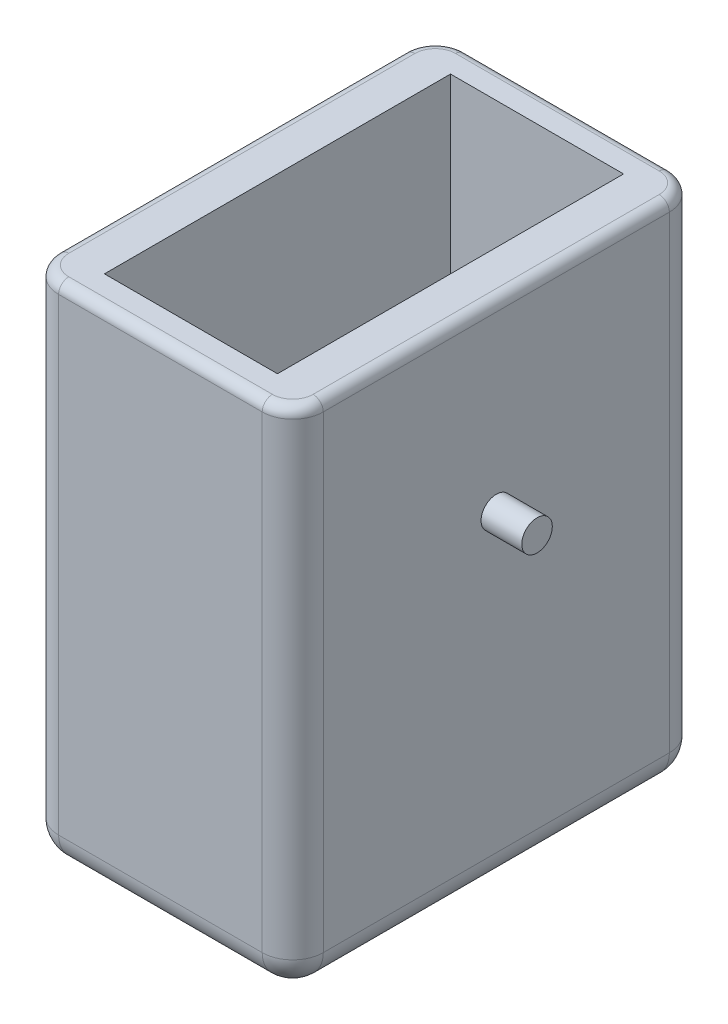
ISO-10303-21;
HEADER;
FILE_DESCRIPTION(('STEP AP214'),'2;1');
FILE_NAME('part.step','',(''),(''),'','','');
FILE_SCHEMA(('AUTOMOTIVE_DESIGN { 1 0 10303 214 1 1 1 1 }'));
ENDSEC;
DATA;
#1=APPLICATION_CONTEXT('core data for automotive mechanical design processes');
#2=APPLICATION_PROTOCOL_DEFINITION('international standard','automotive_design',2000,#1);
#3=PRODUCT_CONTEXT('',#1,'mechanical');
#4=PRODUCT('Part','Part','',(#3));
#5=PRODUCT_RELATED_PRODUCT_CATEGORY('part','',(#4));
#6=PRODUCT_DEFINITION_FORMATION('','',#4);
#7=PRODUCT_DEFINITION_CONTEXT('part definition',#1,'design');
#8=PRODUCT_DEFINITION('design','',#6,#7);
#9=PRODUCT_DEFINITION_SHAPE('','',#8);
#10=(LENGTH_UNIT() NAMED_UNIT(*) SI_UNIT(.MILLI.,.METRE.));
#11=(NAMED_UNIT(*) PLANE_ANGLE_UNIT() SI_UNIT($,.RADIAN.));
#12=(NAMED_UNIT(*) SI_UNIT($,.STERADIAN.) SOLID_ANGLE_UNIT());
#13=UNCERTAINTY_MEASURE_WITH_UNIT(LENGTH_MEASURE(1.E-05),#10,'distance_accuracy_value','');
#14=(GEOMETRIC_REPRESENTATION_CONTEXT(3) GLOBAL_UNCERTAINTY_ASSIGNED_CONTEXT((#13)) GLOBAL_UNIT_ASSIGNED_CONTEXT((#10,
#11,#12)) REPRESENTATION_CONTEXT('',''));
#15=CARTESIAN_POINT('',(0.,0.,0.));
#16=DIRECTION('',(0.,0.,1.));
#17=DIRECTION('',(1.,0.,0.));
#18=AXIS2_PLACEMENT_3D('',#15,#16,#17);
#19=CARTESIAN_POINT('',(0.,50.,0.));
#20=DIRECTION('',(-1.,0.,0.));
#21=DIRECTION('',(0.,0.,1.));
#22=AXIS2_PLACEMENT_3D('',#19,#20,#21);
#23=PLANE('',#22);
#24=CARTESIAN_POINT('',(0.,32.,-20.));
#25=DIRECTION('',(-1.,0.,0.));
#26=DIRECTION('',(0.,0.,1.));
#27=AXIS2_PLACEMENT_3D('',#24,#25,#26);
#28=CIRCLE('',#27,1.5);
#29=CARTESIAN_POINT('',(0.,32.,-18.5));
#30=VERTEX_POINT('',#29);
#31=EDGE_CURVE('E11',#30,#30,#28,.F.);
#32=ORIENTED_EDGE('',*,*,#31,.F.);
#33=EDGE_LOOP('',(#32));
#34=FACE_BOUND('',#33,.T.);
#35=DIRECTION('',(0.,-1.,0.));
#36=VECTOR('',#35,1.);
#37=CARTESIAN_POINT('',(0.,50.,-37.));
#38=LINE('',#37,#36);
#39=CARTESIAN_POINT('',(0.,3.,-37.));
#40=VERTEX_POINT('',#39);
#41=CARTESIAN_POINT('',(0.,49.,-37.));
#42=VERTEX_POINT('',#41);
#43=EDGE_CURVE('E243',#40,#42,#38,.F.);
#44=ORIENTED_EDGE('',*,*,#43,.T.);
#45=DIRECTION('',(0.,0.,-1.));
#46=VECTOR('',#45,1.);
#47=CARTESIAN_POINT('',(0.,49.,-3.));
#48=LINE('',#47,#46);
#49=CARTESIAN_POINT('',(0.,49.,-3.));
#50=VERTEX_POINT('',#49);
#51=EDGE_CURVE('E304',#42,#50,#48,.F.);
#52=ORIENTED_EDGE('',*,*,#51,.T.);
#53=DIRECTION('',(0.,-1.,0.));
#54=VECTOR('',#53,1.);
#55=CARTESIAN_POINT('',(0.,50.,-3.));
#56=LINE('',#55,#54);
#57=CARTESIAN_POINT('',(0.,3.,-3.));
#58=VERTEX_POINT('',#57);
#59=EDGE_CURVE('E239',#50,#58,#56,.T.);
#60=ORIENTED_EDGE('',*,*,#59,.T.);
#61=DIRECTION('',(0.,0.,-1.));
#62=VECTOR('',#61,1.);
#63=CARTESIAN_POINT('',(0.,3.,0.));
#64=LINE('',#63,#62);
#65=EDGE_CURVE('E241',#58,#40,#64,.T.);
#66=ORIENTED_EDGE('',*,*,#65,.T.);
#67=EDGE_LOOP('',(#44,#52,#60,#66));
#68=FACE_BOUND('',#67,.T.);
#69=ADVANCED_FACE('F37',(#34,#68),#23,.F.);
#70=CARTESIAN_POINT('',(0.,50.,-40.));
#71=DIRECTION('',(0.,0.,1.));
#72=DIRECTION('',(1.,0.,0.));
#73=AXIS2_PLACEMENT_3D('',#70,#71,#72);
#74=PLANE('',#73);
#75=DIRECTION('',(0.,-1.,0.));
#76=VECTOR('',#75,1.);
#77=CARTESIAN_POINT('',(-23.,50.,-40.));
#78=LINE('',#77,#76);
#79=CARTESIAN_POINT('',(-23.,3.,-40.));
#80=VERTEX_POINT('',#79);
#81=CARTESIAN_POINT('',(-23.,49.,-40.));
#82=VERTEX_POINT('',#81);
#83=EDGE_CURVE('E215',#80,#82,#78,.F.);
#84=ORIENTED_EDGE('',*,*,#83,.T.);
#85=DIRECTION('',(-1.,0.,0.));
#86=VECTOR('',#85,1.);
#87=CARTESIAN_POINT('',(-3.00000000000001,49.,-40.));
#88=LINE('',#87,#86);
#89=CARTESIAN_POINT('',(-3.00000000000001,49.,-40.));
#90=VERTEX_POINT('',#89);
#91=EDGE_CURVE('E300',#82,#90,#88,.F.);
#92=ORIENTED_EDGE('',*,*,#91,.T.);
#93=DIRECTION('',(0.,-1.,0.));
#94=VECTOR('',#93,1.);
#95=CARTESIAN_POINT('',(-3.00000000000001,50.,-40.));
#96=LINE('',#95,#94);
#97=CARTESIAN_POINT('',(-3.00000000000001,3.,-40.));
#98=VERTEX_POINT('',#97);
#99=EDGE_CURVE('E207',#90,#98,#96,.T.);
#100=ORIENTED_EDGE('',*,*,#99,.T.);
#101=DIRECTION('',(-1.,0.,0.));
#102=VECTOR('',#101,1.);
#103=CARTESIAN_POINT('',(0.,3.,-40.));
#104=LINE('',#103,#102);
#105=EDGE_CURVE('E212',#98,#80,#104,.T.);
#106=ORIENTED_EDGE('',*,*,#105,.T.);
#107=EDGE_LOOP('',(#84,#92,#100,#106));
#108=FACE_BOUND('',#107,.T.);
#109=ADVANCED_FACE('F341',(#108),#74,.F.);
#110=CARTESIAN_POINT('',(-26.,50.,0.));
#111=DIRECTION('',(1.,0.,0.));
#112=DIRECTION('',(0.,0.,-1.));
#113=AXIS2_PLACEMENT_3D('',#110,#111,#112);
#114=PLANE('',#113);
#115=CARTESIAN_POINT('',(-26.,32.,-20.));
#116=DIRECTION('',(1.,0.,0.));
#117=DIRECTION('',(0.,0.,-1.));
#118=AXIS2_PLACEMENT_3D('',#115,#116,#117);
#119=CIRCLE('',#118,1.5);
#120=CARTESIAN_POINT('',(-26.,32.,-21.5));
#121=VERTEX_POINT('',#120);
#122=EDGE_CURVE('E45',#121,#121,#119,.F.);
#123=ORIENTED_EDGE('',*,*,#122,.F.);
#124=EDGE_LOOP('',(#123));
#125=FACE_BOUND('',#124,.T.);
#126=DIRECTION('',(0.,-1.,0.));
#127=VECTOR('',#126,1.);
#128=CARTESIAN_POINT('',(-26.,50.,-3.));
#129=LINE('',#128,#127);
#130=CARTESIAN_POINT('',(-26.,3.,-3.));
#131=VERTEX_POINT('',#130);
#132=CARTESIAN_POINT('',(-26.,49.,-3.));
#133=VERTEX_POINT('',#132);
#134=EDGE_CURVE('E227',#131,#133,#129,.F.);
#135=ORIENTED_EDGE('',*,*,#134,.T.);
#136=DIRECTION('',(0.,0.,1.));
#137=VECTOR('',#136,1.);
#138=CARTESIAN_POINT('',(-26.,49.,-37.));
#139=LINE('',#138,#137);
#140=CARTESIAN_POINT('',(-26.,49.,-37.));
#141=VERTEX_POINT('',#140);
#142=EDGE_CURVE('E310',#133,#141,#139,.F.);
#143=ORIENTED_EDGE('',*,*,#142,.T.);
#144=DIRECTION('',(0.,-1.,0.));
#145=VECTOR('',#144,1.);
#146=CARTESIAN_POINT('',(-26.,50.,-37.));
#147=LINE('',#146,#145);
#148=CARTESIAN_POINT('',(-26.,3.,-37.));
#149=VERTEX_POINT('',#148);
#150=EDGE_CURVE('E231',#141,#149,#147,.T.);
#151=ORIENTED_EDGE('',*,*,#150,.T.);
#152=DIRECTION('',(0.,0.,1.));
#153=VECTOR('',#152,1.);
#154=CARTESIAN_POINT('',(-26.,3.,0.));
#155=LINE('',#154,#153);
#156=EDGE_CURVE('E229',#149,#131,#155,.T.);
#157=ORIENTED_EDGE('',*,*,#156,.T.);
#158=EDGE_LOOP('',(#135,#143,#151,#157));
#159=FACE_BOUND('',#158,.T.);
#160=ADVANCED_FACE('F337',(#125,#159),#114,.F.);
#161=CARTESIAN_POINT('',(0.,50.,0.));
#162=DIRECTION('',(0.,0.,-1.));
#163=DIRECTION('',(-1.,0.,0.));
#164=AXIS2_PLACEMENT_3D('',#161,#162,#163);
#165=PLANE('',#164);
#166=DIRECTION('',(0.,-1.,0.));
#167=VECTOR('',#166,1.);
#168=CARTESIAN_POINT('',(-3.,50.,0.));
#169=LINE('',#168,#167);
#170=CARTESIAN_POINT('',(-3.,3.,0.));
#171=VERTEX_POINT('',#170);
#172=CARTESIAN_POINT('',(-3.,49.,0.));
#173=VERTEX_POINT('',#172);
#174=EDGE_CURVE('E237',#171,#173,#169,.F.);
#175=ORIENTED_EDGE('',*,*,#174,.T.);
#176=DIRECTION('',(1.,0.,0.));
#177=VECTOR('',#176,1.);
#178=CARTESIAN_POINT('',(-23.,49.,0.));
#179=LINE('',#178,#177);
#180=CARTESIAN_POINT('',(-23.,49.,0.));
#181=VERTEX_POINT('',#180);
#182=EDGE_CURVE('E60',#173,#181,#179,.F.);
#183=ORIENTED_EDGE('',*,*,#182,.T.);
#184=DIRECTION('',(0.,-1.,0.));
#185=VECTOR('',#184,1.);
#186=CARTESIAN_POINT('',(-23.,50.,0.));
#187=LINE('',#186,#185);
#188=CARTESIAN_POINT('',(-23.,3.,0.));
#189=VERTEX_POINT('',#188);
#190=EDGE_CURVE('E233',#181,#189,#187,.T.);
#191=ORIENTED_EDGE('',*,*,#190,.T.);
#192=DIRECTION('',(1.,0.,0.));
#193=VECTOR('',#192,1.);
#194=CARTESIAN_POINT('',(0.,3.,0.));
#195=LINE('',#194,#193);
#196=EDGE_CURVE('E235',#189,#171,#195,.T.);
#197=ORIENTED_EDGE('',*,*,#196,.T.);
#198=EDGE_LOOP('',(#175,#183,#191,#197));
#199=FACE_BOUND('',#198,.T.);
#200=ADVANCED_FACE('F340',(#199),#165,.F.);
#201=CARTESIAN_POINT('',(0.,50.,0.));
#202=DIRECTION('',(0.,1.,0.));
#203=DIRECTION('',(0.,0.,1.));
#204=AXIS2_PLACEMENT_3D('',#201,#202,#203);
#205=PLANE('',#204);
#206=DIRECTION('',(-1.,0.,0.));
#207=VECTOR('',#206,1.);
#208=CARTESIAN_POINT('',(-23.,50.,-39.));
#209=LINE('',#208,#207);
#210=CARTESIAN_POINT('',(-3.00000000000001,50.,-39.));
#211=VERTEX_POINT('',#210);
#212=CARTESIAN_POINT('',(-23.,50.,-39.));
#213=VERTEX_POINT('',#212);
#214=EDGE_CURVE('E292',#211,#213,#209,.T.);
#215=ORIENTED_EDGE('',*,*,#214,.T.);
#216=CARTESIAN_POINT('',(-23.,50.,-37.));
#217=DIRECTION('',(0.,1.,0.));
#218=DIRECTION('',(0.,0.,1.));
#219=AXIS2_PLACEMENT_3D('',#216,#217,#218);
#220=CIRCLE('',#219,2.);
#221=CARTESIAN_POINT('',(-25.,50.,-37.));
#222=VERTEX_POINT('',#221);
#223=EDGE_CURVE('E294',#213,#222,#220,.T.);
#224=ORIENTED_EDGE('',*,*,#223,.T.);
#225=DIRECTION('',(0.,0.,1.));
#226=VECTOR('',#225,1.);
#227=CARTESIAN_POINT('',(-25.,50.,-3.));
#228=LINE('',#227,#226);
#229=CARTESIAN_POINT('',(-25.,50.,-3.));
#230=VERTEX_POINT('',#229);
#231=EDGE_CURVE('E246',#222,#230,#228,.T.);
#232=ORIENTED_EDGE('',*,*,#231,.T.);
#233=CARTESIAN_POINT('',(-23.,50.,-3.));
#234=DIRECTION('',(0.,1.,0.));
#235=DIRECTION('',(0.,0.,1.));
#236=AXIS2_PLACEMENT_3D('',#233,#234,#235);
#237=CIRCLE('',#236,2.);
#238=CARTESIAN_POINT('',(-23.,50.,-0.999999999999997));
#239=VERTEX_POINT('',#238);
#240=EDGE_CURVE('E282',#230,#239,#237,.T.);
#241=ORIENTED_EDGE('',*,*,#240,.T.);
#242=DIRECTION('',(1.,0.,0.));
#243=VECTOR('',#242,1.);
#244=CARTESIAN_POINT('',(-3.,50.,-1.));
#245=LINE('',#244,#243);
#246=CARTESIAN_POINT('',(-3.,50.,-1.));
#247=VERTEX_POINT('',#246);
#248=EDGE_CURVE('E284',#239,#247,#245,.T.);
#249=ORIENTED_EDGE('',*,*,#248,.T.);
#250=CARTESIAN_POINT('',(-3.,50.,-3.));
#251=DIRECTION('',(0.,1.,0.));
#252=DIRECTION('',(0.,0.,1.));
#253=AXIS2_PLACEMENT_3D('',#250,#251,#252);
#254=CIRCLE('',#253,2.);
#255=CARTESIAN_POINT('',(-1.,50.,-3.));
#256=VERTEX_POINT('',#255);
#257=EDGE_CURVE('E286',#247,#256,#254,.T.);
#258=ORIENTED_EDGE('',*,*,#257,.T.);
#259=DIRECTION('',(0.,0.,-1.));
#260=VECTOR('',#259,1.);
#261=CARTESIAN_POINT('',(-1.00000000000001,50.,-37.));
#262=LINE('',#261,#260);
#263=CARTESIAN_POINT('',(-1.00000000000001,50.,-37.));
#264=VERTEX_POINT('',#263);
#265=EDGE_CURVE('E288',#256,#264,#262,.T.);
#266=ORIENTED_EDGE('',*,*,#265,.T.);
#267=CARTESIAN_POINT('',(-3.00000000000001,50.,-37.));
#268=DIRECTION('',(0.,1.,0.));
#269=DIRECTION('',(0.,0.,1.));
#270=AXIS2_PLACEMENT_3D('',#267,#268,#269);
#271=CIRCLE('',#270,2.);
#272=EDGE_CURVE('E290',#264,#211,#271,.T.);
#273=ORIENTED_EDGE('',*,*,#272,.T.);
#274=EDGE_LOOP('',(#215,#224,#232,#241,#249,#258,#266,#273));
#275=FACE_BOUND('',#274,.T.);
#276=DIRECTION('',(0.,0.,1.));
#277=VECTOR('',#276,1.);
#278=CARTESIAN_POINT('',(-21.5,50.,-3.));
#279=LINE('',#278,#277);
#280=CARTESIAN_POINT('',(-21.5,50.,-37.));
#281=VERTEX_POINT('',#280);
#282=CARTESIAN_POINT('',(-21.5,50.,-3.));
#283=VERTEX_POINT('',#282);
#284=EDGE_CURVE('E171',#281,#283,#279,.T.);
#285=ORIENTED_EDGE('',*,*,#284,.F.);
#286=DIRECTION('',(-1.,0.,0.));
#287=VECTOR('',#286,1.);
#288=CARTESIAN_POINT('',(-21.5,50.,-37.));
#289=LINE('',#288,#287);
#290=CARTESIAN_POINT('',(-4.5,50.,-37.));
#291=VERTEX_POINT('',#290);
#292=EDGE_CURVE('E188',#291,#281,#289,.T.);
#293=ORIENTED_EDGE('',*,*,#292,.F.);
#294=DIRECTION('',(0.,0.,-1.));
#295=VECTOR('',#294,1.);
#296=CARTESIAN_POINT('',(-4.5,50.,-3.));
#297=LINE('',#296,#295);
#298=CARTESIAN_POINT('',(-4.5,50.,-3.));
#299=VERTEX_POINT('',#298);
#300=EDGE_CURVE('E191',#299,#291,#297,.T.);
#301=ORIENTED_EDGE('',*,*,#300,.F.);
#302=DIRECTION('',(1.,0.,0.));
#303=VECTOR('',#302,1.);
#304=CARTESIAN_POINT('',(-21.5,50.,-3.));
#305=LINE('',#304,#303);
#306=EDGE_CURVE('E200',#283,#299,#305,.T.);
#307=ORIENTED_EDGE('',*,*,#306,.F.);
#308=EDGE_LOOP('',(#285,#293,#301,#307));
#309=FACE_BOUND('',#308,.T.);
#310=ADVANCED_FACE('F393',(#275,#309),#205,.T.);
#311=CARTESIAN_POINT('',(0.,0.,0.));
#312=DIRECTION('',(0.,1.,0.));
#313=DIRECTION('',(0.,0.,1.));
#314=AXIS2_PLACEMENT_3D('',#311,#312,#313);
#315=PLANE('',#314);
#316=DIRECTION('',(0.,0.,1.));
#317=VECTOR('',#316,1.);
#318=CARTESIAN_POINT('',(-23.,0.,0.));
#319=LINE('',#318,#317);
#320=CARTESIAN_POINT('',(-23.,0.,-3.));
#321=VERTEX_POINT('',#320);
#322=CARTESIAN_POINT('',(-23.,0.,-37.));
#323=VERTEX_POINT('',#322);
#324=EDGE_CURVE('E222',#321,#323,#319,.F.);
#325=ORIENTED_EDGE('',*,*,#324,.T.);
#326=DIRECTION('',(-1.,0.,0.));
#327=VECTOR('',#326,1.);
#328=CARTESIAN_POINT('',(0.,0.,-37.));
#329=LINE('',#328,#327);
#330=CARTESIAN_POINT('',(-3.00000000000001,0.,-37.));
#331=VERTEX_POINT('',#330);
#332=EDGE_CURVE('E224',#323,#331,#329,.F.);
#333=ORIENTED_EDGE('',*,*,#332,.T.);
#334=DIRECTION('',(0.,0.,-1.));
#335=VECTOR('',#334,1.);
#336=CARTESIAN_POINT('',(-3.,0.,0.));
#337=LINE('',#336,#335);
#338=CARTESIAN_POINT('',(-3.,0.,-3.));
#339=VERTEX_POINT('',#338);
#340=EDGE_CURVE('E218',#331,#339,#337,.F.);
#341=ORIENTED_EDGE('',*,*,#340,.T.);
#342=DIRECTION('',(1.,0.,0.));
#343=VECTOR('',#342,1.);
#344=CARTESIAN_POINT('',(0.,0.,-3.));
#345=LINE('',#344,#343);
#346=EDGE_CURVE('E220',#339,#321,#345,.F.);
#347=ORIENTED_EDGE('',*,*,#346,.T.);
#348=EDGE_LOOP('',(#325,#333,#341,#347));
#349=FACE_BOUND('',#348,.T.);
#350=ADVANCED_FACE('F495',(#349),#315,.F.);
#351=CARTESIAN_POINT('',(-21.5,3.,-3.));
#352=DIRECTION('',(-1.,0.,0.));
#353=DIRECTION('',(0.,0.,1.));
#354=AXIS2_PLACEMENT_3D('',#351,#352,#353);
#355=PLANE('',#354);
#356=ORIENTED_EDGE('',*,*,#284,.T.);
#357=DIRECTION('',(0.,1.,0.));
#358=VECTOR('',#357,1.);
#359=CARTESIAN_POINT('',(-21.5,3.,-3.));
#360=LINE('',#359,#358);
#361=CARTESIAN_POINT('',(-21.5,3.,-3.));
#362=VERTEX_POINT('',#361);
#363=EDGE_CURVE('E164',#362,#283,#360,.T.);
#364=ORIENTED_EDGE('',*,*,#363,.F.);
#365=DIRECTION('',(0.,0.,1.));
#366=VECTOR('',#365,1.);
#367=CARTESIAN_POINT('',(-21.5,3.,-3.));
#368=LINE('',#367,#366);
#369=CARTESIAN_POINT('',(-21.5,3.,-37.));
#370=VERTEX_POINT('',#369);
#371=EDGE_CURVE('E168',#370,#362,#368,.T.);
#372=ORIENTED_EDGE('',*,*,#371,.F.);
#373=DIRECTION('',(0.,1.,0.));
#374=VECTOR('',#373,1.);
#375=CARTESIAN_POINT('',(-21.5,3.,-37.));
#376=LINE('',#375,#374);
#377=EDGE_CURVE('E205',#370,#281,#376,.T.);
#378=ORIENTED_EDGE('',*,*,#377,.T.);
#379=EDGE_LOOP('',(#356,#364,#372,#378));
#380=FACE_BOUND('',#379,.T.);
#381=ADVANCED_FACE('F166',(#380),#355,.F.);
#382=CARTESIAN_POINT('',(-21.5,3.,-37.));
#383=DIRECTION('',(0.,0.,-1.));
#384=DIRECTION('',(-1.,0.,0.));
#385=AXIS2_PLACEMENT_3D('',#382,#383,#384);
#386=PLANE('',#385);
#387=ORIENTED_EDGE('',*,*,#292,.T.);
#388=ORIENTED_EDGE('',*,*,#377,.F.);
#389=DIRECTION('',(-1.,0.,0.));
#390=VECTOR('',#389,1.);
#391=CARTESIAN_POINT('',(-21.5,3.,-37.));
#392=LINE('',#391,#390);
#393=CARTESIAN_POINT('',(-4.5,3.,-37.));
#394=VERTEX_POINT('',#393);
#395=EDGE_CURVE('E176',#394,#370,#392,.T.);
#396=ORIENTED_EDGE('',*,*,#395,.F.);
#397=DIRECTION('',(0.,1.,0.));
#398=VECTOR('',#397,1.);
#399=CARTESIAN_POINT('',(-4.5,3.,-37.));
#400=LINE('',#399,#398);
#401=EDGE_CURVE('E208',#394,#291,#400,.T.);
#402=ORIENTED_EDGE('',*,*,#401,.T.);
#403=EDGE_LOOP('',(#387,#388,#396,#402));
#404=FACE_BOUND('',#403,.T.);
#405=ADVANCED_FACE('F483',(#404),#386,.F.);
#406=CARTESIAN_POINT('',(-4.5,3.,-3.));
#407=DIRECTION('',(1.,0.,0.));
#408=DIRECTION('',(0.,0.,-1.));
#409=AXIS2_PLACEMENT_3D('',#406,#407,#408);
#410=PLANE('',#409);
#411=ORIENTED_EDGE('',*,*,#300,.T.);
#412=ORIENTED_EDGE('',*,*,#401,.F.);
#413=DIRECTION('',(0.,0.,-1.));
#414=VECTOR('',#413,1.);
#415=CARTESIAN_POINT('',(-4.5,3.,-3.));
#416=LINE('',#415,#414);
#417=CARTESIAN_POINT('',(-4.5,3.,-3.));
#418=VERTEX_POINT('',#417);
#419=EDGE_CURVE('E184',#418,#394,#416,.T.);
#420=ORIENTED_EDGE('',*,*,#419,.F.);
#421=DIRECTION('',(0.,1.,0.));
#422=VECTOR('',#421,1.);
#423=CARTESIAN_POINT('',(-4.5,3.,-3.));
#424=LINE('',#423,#422);
#425=EDGE_CURVE('E175',#418,#299,#424,.T.);
#426=ORIENTED_EDGE('',*,*,#425,.T.);
#427=EDGE_LOOP('',(#411,#412,#420,#426));
#428=FACE_BOUND('',#427,.T.);
#429=ADVANCED_FACE('F486',(#428),#410,.F.);
#430=CARTESIAN_POINT('',(-21.5,3.,-3.));
#431=DIRECTION('',(0.,0.,1.));
#432=DIRECTION('',(1.,0.,0.));
#433=AXIS2_PLACEMENT_3D('',#430,#431,#432);
#434=PLANE('',#433);
#435=ORIENTED_EDGE('',*,*,#306,.T.);
#436=ORIENTED_EDGE('',*,*,#425,.F.);
#437=DIRECTION('',(1.,0.,0.));
#438=VECTOR('',#437,1.);
#439=CARTESIAN_POINT('',(-21.5,3.,-3.));
#440=LINE('',#439,#438);
#441=EDGE_CURVE('E179',#362,#418,#440,.T.);
#442=ORIENTED_EDGE('',*,*,#441,.F.);
#443=ORIENTED_EDGE('',*,*,#363,.T.);
#444=EDGE_LOOP('',(#435,#436,#442,#443));
#445=FACE_BOUND('',#444,.T.);
#446=ADVANCED_FACE('F180',(#445),#434,.F.);
#447=CARTESIAN_POINT('',(0.,3.,0.));
#448=DIRECTION('',(0.,-1.,0.));
#449=DIRECTION('',(0.,0.,-1.));
#450=AXIS2_PLACEMENT_3D('',#447,#448,#449);
#451=PLANE('',#450);
#452=ORIENTED_EDGE('',*,*,#371,.T.);
#453=ORIENTED_EDGE('',*,*,#441,.T.);
#454=ORIENTED_EDGE('',*,*,#419,.T.);
#455=ORIENTED_EDGE('',*,*,#395,.T.);
#456=EDGE_LOOP('',(#452,#453,#454,#455));
#457=FACE_BOUND('',#456,.T.);
#458=ADVANCED_FACE('F186',(#457),#451,.F.);
#459=CARTESIAN_POINT('',(-3.,50.,-3.));
#460=DIRECTION('',(0.,-1.,0.));
#461=DIRECTION('',(0.,0.,-1.));
#462=AXIS2_PLACEMENT_3D('',#459,#460,#461);
#463=CYLINDRICAL_SURFACE('',#462,3.);
#464=ORIENTED_EDGE('',*,*,#59,.F.);
#465=CARTESIAN_POINT('',(-3.,49.,-3.));
#466=DIRECTION('',(0.,1.,0.));
#467=DIRECTION('',(0.,0.,1.));
#468=AXIS2_PLACEMENT_3D('',#465,#466,#467);
#469=CIRCLE('',#468,3.);
#470=EDGE_CURVE('E306',#50,#173,#469,.F.);
#471=ORIENTED_EDGE('',*,*,#470,.T.);
#472=ORIENTED_EDGE('',*,*,#174,.F.);
#473=CARTESIAN_POINT('',(-3.,3.,-3.));
#474=DIRECTION('',(0.,-1.,0.));
#475=DIRECTION('',(0.,0.,-1.));
#476=AXIS2_PLACEMENT_3D('',#473,#474,#475);
#477=CIRCLE('',#476,3.);
#478=EDGE_CURVE('E276',#58,#171,#477,.T.);
#479=ORIENTED_EDGE('',*,*,#478,.F.);
#480=EDGE_LOOP('',(#464,#471,#472,#479));
#481=FACE_BOUND('',#480,.T.);
#482=ADVANCED_FACE('F461',(#481),#463,.T.);
#483=CARTESIAN_POINT('',(-23.,50.,-3.));
#484=DIRECTION('',(0.,-1.,0.));
#485=DIRECTION('',(0.,0.,-1.));
#486=AXIS2_PLACEMENT_3D('',#483,#484,#485);
#487=CYLINDRICAL_SURFACE('',#486,3.);
#488=ORIENTED_EDGE('',*,*,#190,.F.);
#489=CARTESIAN_POINT('',(-23.,49.,-3.));
#490=DIRECTION('',(0.,1.,0.));
#491=DIRECTION('',(0.,0.,1.));
#492=AXIS2_PLACEMENT_3D('',#489,#490,#491);
#493=CIRCLE('',#492,3.);
#494=EDGE_CURVE('E52',#181,#133,#493,.F.);
#495=ORIENTED_EDGE('',*,*,#494,.T.);
#496=ORIENTED_EDGE('',*,*,#134,.F.);
#497=CARTESIAN_POINT('',(-23.,3.,-3.));
#498=DIRECTION('',(0.,-1.,0.));
#499=DIRECTION('',(0.,0.,-1.));
#500=AXIS2_PLACEMENT_3D('',#497,#498,#499);
#501=CIRCLE('',#500,3.);
#502=EDGE_CURVE('E273',#189,#131,#501,.T.);
#503=ORIENTED_EDGE('',*,*,#502,.F.);
#504=EDGE_LOOP('',(#488,#495,#496,#503));
#505=FACE_BOUND('',#504,.T.);
#506=ADVANCED_FACE('F384',(#505),#487,.T.);
#507=CARTESIAN_POINT('',(0.,3.,-3.));
#508=DIRECTION('',(1.,0.,0.));
#509=DIRECTION('',(0.,0.,-1.));
#510=AXIS2_PLACEMENT_3D('',#507,#508,#509);
#511=CYLINDRICAL_SURFACE('',#510,3.);
#512=CARTESIAN_POINT('',(-3.,3.,-3.));
#513=DIRECTION('',(1.,0.,0.));
#514=DIRECTION('',(0.,0.,-1.));
#515=AXIS2_PLACEMENT_3D('',#512,#513,#514);
#516=CIRCLE('',#515,3.);
#517=EDGE_CURVE('E201',#171,#339,#516,.T.);
#518=ORIENTED_EDGE('',*,*,#517,.F.);
#519=ORIENTED_EDGE('',*,*,#196,.F.);
#520=CARTESIAN_POINT('',(-23.,3.,-3.));
#521=DIRECTION('',(-1.,0.,0.));
#522=DIRECTION('',(0.,0.,1.));
#523=AXIS2_PLACEMENT_3D('',#520,#521,#522);
#524=CIRCLE('',#523,3.);
#525=EDGE_CURVE('E270',#321,#189,#524,.T.);
#526=ORIENTED_EDGE('',*,*,#525,.F.);
#527=ORIENTED_EDGE('',*,*,#346,.F.);
#528=EDGE_LOOP('',(#518,#519,#526,#527));
#529=FACE_BOUND('',#528,.T.);
#530=ADVANCED_FACE('F454',(#529),#511,.T.);
#531=CARTESIAN_POINT('',(-3.,3.,-3.));
#532=DIRECTION('',(0.,0.,1.));
#533=DIRECTION('',(1.,0.,0.));
#534=AXIS2_PLACEMENT_3D('',#531,#532,#533);
#535=SPHERICAL_SURFACE('',#534,3.);
#536=ORIENTED_EDGE('',*,*,#478,.T.);
#537=ORIENTED_EDGE('',*,*,#517,.T.);
#538=CARTESIAN_POINT('',(-3.,3.,-3.));
#539=DIRECTION('',(0.,0.,1.));
#540=DIRECTION('',(1.,0.,0.));
#541=AXIS2_PLACEMENT_3D('',#538,#539,#540);
#542=CIRCLE('',#541,3.);
#543=EDGE_CURVE('E267',#58,#339,#542,.F.);
#544=ORIENTED_EDGE('',*,*,#543,.F.);
#545=EDGE_LOOP('',(#536,#537,#544));
#546=FACE_BOUND('',#545,.T.);
#547=ADVANCED_FACE('F451',(#546),#535,.T.);
#548=CARTESIAN_POINT('',(-23.,3.,-3.));
#549=DIRECTION('',(0.,0.,1.));
#550=DIRECTION('',(1.,0.,0.));
#551=AXIS2_PLACEMENT_3D('',#548,#549,#550);
#552=SPHERICAL_SURFACE('',#551,3.);
#553=ORIENTED_EDGE('',*,*,#525,.T.);
#554=ORIENTED_EDGE('',*,*,#502,.T.);
#555=CARTESIAN_POINT('',(-23.,3.,-3.));
#556=DIRECTION('',(0.,0.,1.));
#557=DIRECTION('',(1.,0.,0.));
#558=AXIS2_PLACEMENT_3D('',#555,#556,#557);
#559=CIRCLE('',#558,3.);
#560=EDGE_CURVE('E264',#321,#131,#559,.F.);
#561=ORIENTED_EDGE('',*,*,#560,.F.);
#562=EDGE_LOOP('',(#553,#554,#561));
#563=FACE_BOUND('',#562,.T.);
#564=ADVANCED_FACE('F382',(#563),#552,.T.);
#565=CARTESIAN_POINT('',(-3.,3.,0.));
#566=DIRECTION('',(0.,0.,-1.));
#567=DIRECTION('',(-1.,0.,0.));
#568=AXIS2_PLACEMENT_3D('',#565,#566,#567);
#569=CYLINDRICAL_SURFACE('',#568,3.);
#570=ORIENTED_EDGE('',*,*,#543,.T.);
#571=ORIENTED_EDGE('',*,*,#340,.F.);
#572=CARTESIAN_POINT('',(-3.00000000000001,3.,-37.));
#573=DIRECTION('',(0.,0.,-1.));
#574=DIRECTION('',(-1.,0.,0.));
#575=AXIS2_PLACEMENT_3D('',#572,#573,#574);
#576=CIRCLE('',#575,3.);
#577=EDGE_CURVE('E261',#40,#331,#576,.T.);
#578=ORIENTED_EDGE('',*,*,#577,.F.);
#579=ORIENTED_EDGE('',*,*,#65,.F.);
#580=EDGE_LOOP('',(#570,#571,#578,#579));
#581=FACE_BOUND('',#580,.T.);
#582=ADVANCED_FACE('F444',(#581),#569,.T.);
#583=CARTESIAN_POINT('',(-3.00000000000001,50.,-37.));
#584=DIRECTION('',(0.,-1.,0.));
#585=DIRECTION('',(0.,0.,-1.));
#586=AXIS2_PLACEMENT_3D('',#583,#584,#585);
#587=CYLINDRICAL_SURFACE('',#586,3.);
#588=ORIENTED_EDGE('',*,*,#99,.F.);
#589=CARTESIAN_POINT('',(-3.00000000000001,49.,-37.));
#590=DIRECTION('',(0.,1.,0.));
#591=DIRECTION('',(0.,0.,1.));
#592=AXIS2_PLACEMENT_3D('',#589,#590,#591);
#593=CIRCLE('',#592,3.);
#594=EDGE_CURVE('E302',#90,#42,#593,.F.);
#595=ORIENTED_EDGE('',*,*,#594,.T.);
#596=ORIENTED_EDGE('',*,*,#43,.F.);
#597=CARTESIAN_POINT('',(-3.00000000000001,3.,-37.));
#598=DIRECTION('',(0.,-1.,0.));
#599=DIRECTION('',(0.,0.,-1.));
#600=AXIS2_PLACEMENT_3D('',#597,#598,#599);
#601=CIRCLE('',#600,3.);
#602=EDGE_CURVE('E258',#98,#40,#601,.T.);
#603=ORIENTED_EDGE('',*,*,#602,.F.);
#604=EDGE_LOOP('',(#588,#595,#596,#603));
#605=FACE_BOUND('',#604,.T.);
#606=ADVANCED_FACE('F441',(#605),#587,.T.);
#607=CARTESIAN_POINT('',(-23.,50.,-37.));
#608=DIRECTION('',(0.,-1.,0.));
#609=DIRECTION('',(0.,0.,-1.));
#610=AXIS2_PLACEMENT_3D('',#607,#608,#609);
#611=CYLINDRICAL_SURFACE('',#610,3.);
#612=ORIENTED_EDGE('',*,*,#150,.F.);
#613=CARTESIAN_POINT('',(-23.,49.,-37.));
#614=DIRECTION('',(0.,1.,0.));
#615=DIRECTION('',(0.,0.,1.));
#616=AXIS2_PLACEMENT_3D('',#613,#614,#615);
#617=CIRCLE('',#616,3.);
#618=EDGE_CURVE('E297',#141,#82,#617,.F.);
#619=ORIENTED_EDGE('',*,*,#618,.T.);
#620=ORIENTED_EDGE('',*,*,#83,.F.);
#621=CARTESIAN_POINT('',(-23.,3.,-37.));
#622=DIRECTION('',(0.,-1.,0.));
#623=DIRECTION('',(0.,0.,-1.));
#624=AXIS2_PLACEMENT_3D('',#621,#622,#623);
#625=CIRCLE('',#624,3.);
#626=EDGE_CURVE('E255',#149,#80,#625,.T.);
#627=ORIENTED_EDGE('',*,*,#626,.F.);
#628=EDGE_LOOP('',(#612,#619,#620,#627));
#629=FACE_BOUND('',#628,.T.);
#630=ADVANCED_FACE('F363',(#629),#611,.T.);
#631=CARTESIAN_POINT('',(-23.,3.,0.));
#632=DIRECTION('',(0.,0.,1.));
#633=DIRECTION('',(1.,0.,0.));
#634=AXIS2_PLACEMENT_3D('',#631,#632,#633);
#635=CYLINDRICAL_SURFACE('',#634,3.);
#636=ORIENTED_EDGE('',*,*,#560,.T.);
#637=ORIENTED_EDGE('',*,*,#156,.F.);
#638=CARTESIAN_POINT('',(-23.,3.,-37.));
#639=DIRECTION('',(0.,0.,-1.));
#640=DIRECTION('',(-1.,0.,0.));
#641=AXIS2_PLACEMENT_3D('',#638,#639,#640);
#642=CIRCLE('',#641,3.);
#643=EDGE_CURVE('E252',#323,#149,#642,.T.);
#644=ORIENTED_EDGE('',*,*,#643,.F.);
#645=ORIENTED_EDGE('',*,*,#324,.F.);
#646=EDGE_LOOP('',(#636,#637,#644,#645));
#647=FACE_BOUND('',#646,.T.);
#648=ADVANCED_FACE('F379',(#647),#635,.T.);
#649=CARTESIAN_POINT('',(-3.00000000000001,3.,-37.));
#650=DIRECTION('',(0.,0.,1.));
#651=DIRECTION('',(1.,0.,0.));
#652=AXIS2_PLACEMENT_3D('',#649,#650,#651);
#653=SPHERICAL_SURFACE('',#652,3.);
#654=ORIENTED_EDGE('',*,*,#602,.T.);
#655=ORIENTED_EDGE('',*,*,#577,.T.);
#656=CARTESIAN_POINT('',(-3.00000000000001,3.,-37.));
#657=DIRECTION('',(1.,0.,0.));
#658=DIRECTION('',(0.,0.,-1.));
#659=AXIS2_PLACEMENT_3D('',#656,#657,#658);
#660=CIRCLE('',#659,3.);
#661=EDGE_CURVE('E249',#98,#331,#660,.F.);
#662=ORIENTED_EDGE('',*,*,#661,.F.);
#663=EDGE_LOOP('',(#654,#655,#662));
#664=FACE_BOUND('',#663,.T.);
#665=ADVANCED_FACE('F433',(#664),#653,.T.);
#666=CARTESIAN_POINT('',(-23.,3.,-37.));
#667=DIRECTION('',(0.,0.,1.));
#668=DIRECTION('',(1.,0.,0.));
#669=AXIS2_PLACEMENT_3D('',#666,#667,#668);
#670=SPHERICAL_SURFACE('',#669,3.);
#671=ORIENTED_EDGE('',*,*,#643,.T.);
#672=ORIENTED_EDGE('',*,*,#626,.T.);
#673=CARTESIAN_POINT('',(-23.,3.,-37.));
#674=DIRECTION('',(-1.,0.,0.));
#675=DIRECTION('',(0.,0.,1.));
#676=AXIS2_PLACEMENT_3D('',#673,#674,#675);
#677=CIRCLE('',#676,3.);
#678=EDGE_CURVE('E247',#323,#80,#677,.F.);
#679=ORIENTED_EDGE('',*,*,#678,.F.);
#680=EDGE_LOOP('',(#671,#672,#679));
#681=FACE_BOUND('',#680,.T.);
#682=ADVANCED_FACE('F375',(#681),#670,.T.);
#683=CARTESIAN_POINT('',(0.,3.,-37.));
#684=DIRECTION('',(-1.,0.,0.));
#685=DIRECTION('',(0.,0.,1.));
#686=AXIS2_PLACEMENT_3D('',#683,#684,#685);
#687=CYLINDRICAL_SURFACE('',#686,3.);
#688=ORIENTED_EDGE('',*,*,#661,.T.);
#689=ORIENTED_EDGE('',*,*,#332,.F.);
#690=ORIENTED_EDGE('',*,*,#678,.T.);
#691=ORIENTED_EDGE('',*,*,#105,.F.);
#692=EDGE_LOOP('',(#688,#689,#690,#691));
#693=FACE_BOUND('',#692,.T.);
#694=ADVANCED_FACE('F370',(#693),#687,.T.);
#695=CARTESIAN_POINT('',(-3.,49.,-3.));
#696=DIRECTION('',(0.,1.,0.));
#697=DIRECTION('',(0.,0.,1.));
#698=AXIS2_PLACEMENT_3D('',#695,#696,#697);
#699=TOROIDAL_SURFACE('',#698,2.,1.);
#700=CARTESIAN_POINT('',(-3.,49.,-1.));
#701=DIRECTION('',(-1.,0.,0.));
#702=DIRECTION('',(0.,0.,1.));
#703=AXIS2_PLACEMENT_3D('',#700,#701,#702);
#704=CIRCLE('',#703,1.);
#705=EDGE_CURVE('E328',#173,#247,#704,.T.);
#706=ORIENTED_EDGE('',*,*,#705,.F.);
#707=ORIENTED_EDGE('',*,*,#470,.F.);
#708=CARTESIAN_POINT('',(-1.,49.,-3.));
#709=DIRECTION('',(0.,0.,-1.));
#710=DIRECTION('',(-1.,0.,0.));
#711=AXIS2_PLACEMENT_3D('',#708,#709,#710);
#712=CIRCLE('',#711,1.);
#713=EDGE_CURVE('E250',#256,#50,#712,.T.);
#714=ORIENTED_EDGE('',*,*,#713,.F.);
#715=ORIENTED_EDGE('',*,*,#257,.F.);
#716=EDGE_LOOP('',(#706,#707,#714,#715));
#717=FACE_BOUND('',#716,.T.);
#718=ADVANCED_FACE('F39',(#717),#699,.T.);
#719=CARTESIAN_POINT('',(-1.,49.,0.));
#720=DIRECTION('',(0.,0.,1.));
#721=DIRECTION('',(1.,0.,0.));
#722=AXIS2_PLACEMENT_3D('',#719,#720,#721);
#723=CYLINDRICAL_SURFACE('',#722,1.);
#724=ORIENTED_EDGE('',*,*,#713,.T.);
#725=ORIENTED_EDGE('',*,*,#51,.F.);
#726=CARTESIAN_POINT('',(-1.00000000000001,49.,-37.));
#727=DIRECTION('',(0.,0.,-1.));
#728=DIRECTION('',(-1.,0.,0.));
#729=AXIS2_PLACEMENT_3D('',#726,#727,#728);
#730=CIRCLE('',#729,1.);
#731=EDGE_CURVE('E325',#264,#42,#730,.T.);
#732=ORIENTED_EDGE('',*,*,#731,.F.);
#733=ORIENTED_EDGE('',*,*,#265,.F.);
#734=EDGE_LOOP('',(#724,#725,#732,#733));
#735=FACE_BOUND('',#734,.T.);
#736=ADVANCED_FACE('F402',(#735),#723,.T.);
#737=CARTESIAN_POINT('',(0.,49.,-1.));
#738=DIRECTION('',(-1.,0.,0.));
#739=DIRECTION('',(0.,0.,1.));
#740=AXIS2_PLACEMENT_3D('',#737,#738,#739);
#741=CYLINDRICAL_SURFACE('',#740,1.);
#742=ORIENTED_EDGE('',*,*,#705,.T.);
#743=ORIENTED_EDGE('',*,*,#248,.F.);
#744=CARTESIAN_POINT('',(-23.,49.,-0.999999999999997));
#745=DIRECTION('',(-1.,0.,0.));
#746=DIRECTION('',(0.,0.,1.));
#747=AXIS2_PLACEMENT_3D('',#744,#745,#746);
#748=CIRCLE('',#747,1.);
#749=EDGE_CURVE('E322',#181,#239,#748,.T.);
#750=ORIENTED_EDGE('',*,*,#749,.F.);
#751=ORIENTED_EDGE('',*,*,#182,.F.);
#752=EDGE_LOOP('',(#742,#743,#750,#751));
#753=FACE_BOUND('',#752,.T.);
#754=ADVANCED_FACE('F389',(#753),#741,.T.);
#755=CARTESIAN_POINT('',(-3.00000000000001,49.,-37.));
#756=DIRECTION('',(0.,1.,0.));
#757=DIRECTION('',(0.,0.,1.));
#758=AXIS2_PLACEMENT_3D('',#755,#756,#757);
#759=TOROIDAL_SURFACE('',#758,2.,1.);
#760=ORIENTED_EDGE('',*,*,#731,.T.);
#761=ORIENTED_EDGE('',*,*,#594,.F.);
#762=CARTESIAN_POINT('',(-3.00000000000001,49.,-39.));
#763=DIRECTION('',(-1.,0.,0.));
#764=DIRECTION('',(0.,0.,1.));
#765=AXIS2_PLACEMENT_3D('',#762,#763,#764);
#766=CIRCLE('',#765,1.);
#767=EDGE_CURVE('E319',#211,#90,#766,.T.);
#768=ORIENTED_EDGE('',*,*,#767,.F.);
#769=ORIENTED_EDGE('',*,*,#272,.F.);
#770=EDGE_LOOP('',(#760,#761,#768,#769));
#771=FACE_BOUND('',#770,.T.);
#772=ADVANCED_FACE('F408',(#771),#759,.T.);
#773=CARTESIAN_POINT('',(-23.,49.,-3.));
#774=DIRECTION('',(0.,1.,0.));
#775=DIRECTION('',(0.,0.,1.));
#776=AXIS2_PLACEMENT_3D('',#773,#774,#775);
#777=TOROIDAL_SURFACE('',#776,2.,1.);
#778=ORIENTED_EDGE('',*,*,#749,.T.);
#779=ORIENTED_EDGE('',*,*,#240,.F.);
#780=CARTESIAN_POINT('',(-25.,49.,-3.));
#781=DIRECTION('',(0.,0.,-1.));
#782=DIRECTION('',(-1.,0.,0.));
#783=AXIS2_PLACEMENT_3D('',#780,#781,#782);
#784=CIRCLE('',#783,1.);
#785=EDGE_CURVE('E316',#133,#230,#784,.T.);
#786=ORIENTED_EDGE('',*,*,#785,.F.);
#787=ORIENTED_EDGE('',*,*,#494,.F.);
#788=EDGE_LOOP('',(#778,#779,#786,#787));
#789=FACE_BOUND('',#788,.T.);
#790=ADVANCED_FACE('F350',(#789),#777,.T.);
#791=CARTESIAN_POINT('',(0.,49.,-39.));
#792=DIRECTION('',(1.,0.,0.));
#793=DIRECTION('',(0.,0.,-1.));
#794=AXIS2_PLACEMENT_3D('',#791,#792,#793);
#795=CYLINDRICAL_SURFACE('',#794,1.);
#796=ORIENTED_EDGE('',*,*,#767,.T.);
#797=ORIENTED_EDGE('',*,*,#91,.F.);
#798=CARTESIAN_POINT('',(-23.,49.,-39.));
#799=DIRECTION('',(-1.,0.,0.));
#800=DIRECTION('',(0.,0.,1.));
#801=AXIS2_PLACEMENT_3D('',#798,#799,#800);
#802=CIRCLE('',#801,1.);
#803=EDGE_CURVE('E314',#213,#82,#802,.T.);
#804=ORIENTED_EDGE('',*,*,#803,.F.);
#805=ORIENTED_EDGE('',*,*,#214,.F.);
#806=EDGE_LOOP('',(#796,#797,#804,#805));
#807=FACE_BOUND('',#806,.T.);
#808=ADVANCED_FACE('F410',(#807),#795,.T.);
#809=CARTESIAN_POINT('',(-25.,49.,0.));
#810=DIRECTION('',(0.,0.,-1.));
#811=DIRECTION('',(-1.,0.,0.));
#812=AXIS2_PLACEMENT_3D('',#809,#810,#811);
#813=CYLINDRICAL_SURFACE('',#812,1.);
#814=ORIENTED_EDGE('',*,*,#785,.T.);
#815=ORIENTED_EDGE('',*,*,#231,.F.);
#816=CARTESIAN_POINT('',(-25.,49.,-37.));
#817=DIRECTION('',(0.,0.,-1.));
#818=DIRECTION('',(-1.,0.,0.));
#819=AXIS2_PLACEMENT_3D('',#816,#817,#818);
#820=CIRCLE('',#819,1.);
#821=EDGE_CURVE('E312',#141,#222,#820,.T.);
#822=ORIENTED_EDGE('',*,*,#821,.F.);
#823=ORIENTED_EDGE('',*,*,#142,.F.);
#824=EDGE_LOOP('',(#814,#815,#822,#823));
#825=FACE_BOUND('',#824,.T.);
#826=ADVANCED_FACE('F354',(#825),#813,.T.);
#827=CARTESIAN_POINT('',(-23.,49.,-37.));
#828=DIRECTION('',(0.,1.,0.));
#829=DIRECTION('',(0.,0.,1.));
#830=AXIS2_PLACEMENT_3D('',#827,#828,#829);
#831=TOROIDAL_SURFACE('',#830,2.,1.);
#832=ORIENTED_EDGE('',*,*,#803,.T.);
#833=ORIENTED_EDGE('',*,*,#618,.F.);
#834=ORIENTED_EDGE('',*,*,#821,.T.);
#835=ORIENTED_EDGE('',*,*,#223,.F.);
#836=EDGE_LOOP('',(#832,#833,#834,#835));
#837=FACE_BOUND('',#836,.T.);
#838=ADVANCED_FACE('F358',(#837),#831,.T.);
#839=CARTESIAN_POINT('',(-30.,32.,-20.));
#840=DIRECTION('',(1.,0.,0.));
#841=DIRECTION('',(0.,0.,-1.));
#842=AXIS2_PLACEMENT_3D('',#839,#840,#841);
#843=CYLINDRICAL_SURFACE('',#842,1.5);
#844=CARTESIAN_POINT('',(-30.,32.,-20.));
#845=DIRECTION('',(-1.,0.,0.));
#846=DIRECTION('',(0.,0.,1.));
#847=AXIS2_PLACEMENT_3D('',#844,#845,#846);
#848=CIRCLE('',#847,1.5);
#849=CARTESIAN_POINT('',(-30.,32.,-18.5));
#850=VERTEX_POINT('',#849);
#851=EDGE_CURVE('E194',#850,#850,#848,.T.);
#852=ORIENTED_EDGE('',*,*,#851,.F.);
#853=EDGE_LOOP('',(#852));
#854=FACE_BOUND('',#853,.T.);
#855=ORIENTED_EDGE('',*,*,#122,.T.);
#856=EDGE_LOOP('',(#855));
#857=FACE_BOUND('',#856,.T.);
#858=ADVANCED_FACE('F335',(#854,#857),#843,.T.);
#859=CARTESIAN_POINT('',(-30.,32.,-20.));
#860=DIRECTION('',(-1.,0.,0.));
#861=DIRECTION('',(0.,0.,1.));
#862=AXIS2_PLACEMENT_3D('',#859,#860,#861);
#863=PLANE('',#862);
#864=ORIENTED_EDGE('',*,*,#851,.T.);
#865=EDGE_LOOP('',(#864));
#866=FACE_BOUND('',#865,.T.);
#867=ADVANCED_FACE('F469',(#866),#863,.T.);
#868=CARTESIAN_POINT('',(4.,32.,-20.));
#869=DIRECTION('',(-1.,0.,0.));
#870=DIRECTION('',(0.,0.,1.));
#871=AXIS2_PLACEMENT_3D('',#868,#869,#870);
#872=CYLINDRICAL_SURFACE('',#871,1.5);
#873=CARTESIAN_POINT('',(4.,32.,-20.));
#874=DIRECTION('',(1.,0.,0.));
#875=DIRECTION('',(0.,0.,-1.));
#876=AXIS2_PLACEMENT_3D('',#873,#874,#875);
#877=CIRCLE('',#876,1.5);
#878=CARTESIAN_POINT('',(4.,32.,-21.5));
#879=VERTEX_POINT('',#878);
#880=EDGE_CURVE('E678',#879,#879,#877,.T.);
#881=ORIENTED_EDGE('',*,*,#880,.F.);
#882=EDGE_LOOP('',(#881));
#883=FACE_BOUND('',#882,.T.);
#884=ORIENTED_EDGE('',*,*,#31,.T.);
#885=EDGE_LOOP('',(#884));
#886=FACE_BOUND('',#885,.T.);
#887=ADVANCED_FACE('F475',(#883,#886),#872,.T.);
#888=CARTESIAN_POINT('',(4.,32.,-20.));
#889=DIRECTION('',(1.,0.,0.));
#890=DIRECTION('',(0.,0.,-1.));
#891=AXIS2_PLACEMENT_3D('',#888,#889,#890);
#892=PLANE('',#891);
#893=ORIENTED_EDGE('',*,*,#880,.T.);
#894=EDGE_LOOP('',(#893));
#895=FACE_BOUND('',#894,.T.);
#896=ADVANCED_FACE('F663',(#895),#892,.T.);
#897=CLOSED_SHELL('',(#69,#109,#160,#200,#310,#350,#381,#405,#429,#446,#458,#482,#506,#530,#547,
#564,#582,#606,#630,#648,#665,#682,#694,#718,#736,#754,#772,#790,#808,#826,#838,#858,#867,#887,#896));
#898=MANIFOLD_SOLID_BREP('B2',#897);
#899=ADVANCED_BREP_SHAPE_REPRESENTATION('',(#18,#898),#14);
#900=SHAPE_DEFINITION_REPRESENTATION(#9,#899);
ENDSEC;
END-ISO-10303-21;
